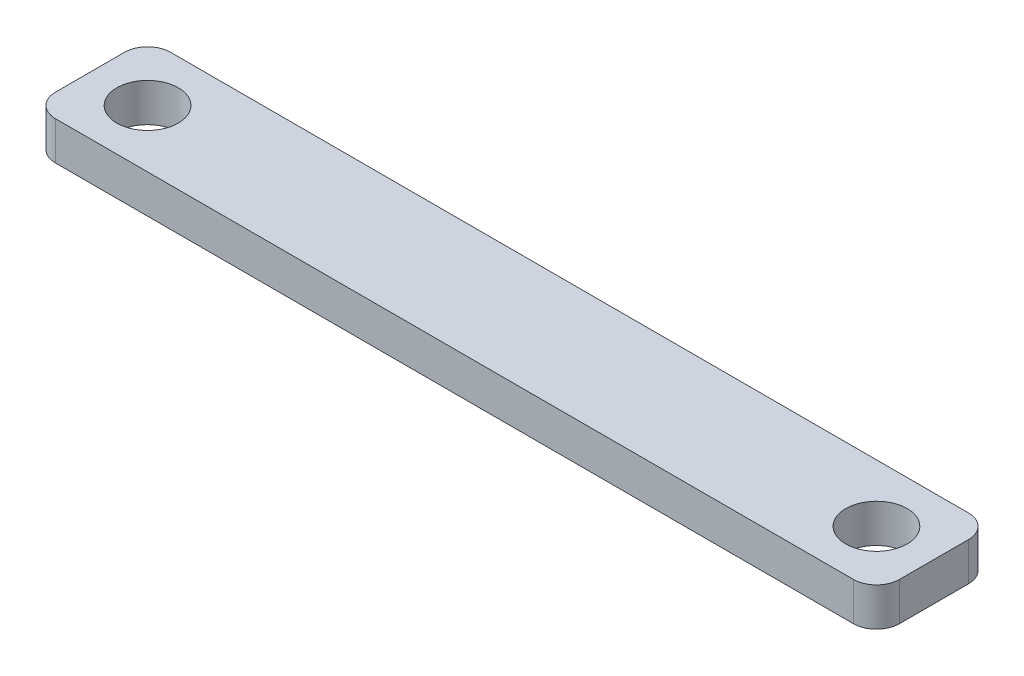
ISO-10303-21;
HEADER;
FILE_DESCRIPTION(('STEP AP214'),'2;1');
FILE_NAME('part.step','',(''),(''),'','','');
FILE_SCHEMA(('AUTOMOTIVE_DESIGN { 1 0 10303 214 1 1 1 1 }'));
ENDSEC;
DATA;
#1=APPLICATION_CONTEXT('core data for automotive mechanical design processes');
#2=APPLICATION_PROTOCOL_DEFINITION('international standard','automotive_design',2000,#1);
#3=PRODUCT_CONTEXT('',#1,'mechanical');
#4=PRODUCT('Part','Part','',(#3));
#5=PRODUCT_RELATED_PRODUCT_CATEGORY('part','',(#4));
#6=PRODUCT_DEFINITION_FORMATION('','',#4);
#7=PRODUCT_DEFINITION_CONTEXT('part definition',#1,'design');
#8=PRODUCT_DEFINITION('design','',#6,#7);
#9=PRODUCT_DEFINITION_SHAPE('','',#8);
#10=(LENGTH_UNIT() NAMED_UNIT(*) SI_UNIT(.MILLI.,.METRE.));
#11=(NAMED_UNIT(*) PLANE_ANGLE_UNIT() SI_UNIT($,.RADIAN.));
#12=(NAMED_UNIT(*) SI_UNIT($,.STERADIAN.) SOLID_ANGLE_UNIT());
#13=UNCERTAINTY_MEASURE_WITH_UNIT(LENGTH_MEASURE(1.E-05),#10,'distance_accuracy_value','');
#14=(GEOMETRIC_REPRESENTATION_CONTEXT(3) GLOBAL_UNCERTAINTY_ASSIGNED_CONTEXT((#13)) GLOBAL_UNIT_ASSIGNED_CONTEXT((#10,
#11,#12)) REPRESENTATION_CONTEXT('',''));
#15=CARTESIAN_POINT('',(0.,0.,0.));
#16=DIRECTION('',(0.,0.,1.));
#17=DIRECTION('',(1.,0.,0.));
#18=AXIS2_PLACEMENT_3D('',#15,#16,#17);
#19=CARTESIAN_POINT('',(55.,5.,7.5));
#20=DIRECTION('',(-1.,0.,0.));
#21=DIRECTION('',(0.,0.,1.));
#22=AXIS2_PLACEMENT_3D('',#19,#20,#21);
#23=PLANE('',#22);
#24=DIRECTION('',(0.,0.,-1.));
#25=VECTOR('',#24,1.);
#26=CARTESIAN_POINT('',(55.,5.,7.5));
#27=LINE('',#26,#25);
#28=CARTESIAN_POINT('',(55.,5.,4.5));
#29=VERTEX_POINT('',#28);
#30=CARTESIAN_POINT('',(55.,5.,-4.5));
#31=VERTEX_POINT('',#30);
#32=EDGE_CURVE('E118',#29,#31,#27,.T.);
#33=ORIENTED_EDGE('',*,*,#32,.F.);
#34=DIRECTION('',(0.,-1.,0.));
#35=VECTOR('',#34,1.);
#36=CARTESIAN_POINT('',(55.,5.,4.5));
#37=LINE('',#36,#35);
#38=CARTESIAN_POINT('',(55.,0.,4.5));
#39=VERTEX_POINT('',#38);
#40=EDGE_CURVE('E103',#29,#39,#37,.T.);
#41=ORIENTED_EDGE('',*,*,#40,.T.);
#42=DIRECTION('',(0.,0.,-1.));
#43=VECTOR('',#42,1.);
#44=CARTESIAN_POINT('',(55.,0.,7.5));
#45=LINE('',#44,#43);
#46=CARTESIAN_POINT('',(55.,0.,-4.5));
#47=VERTEX_POINT('',#46);
#48=EDGE_CURVE('E115',#39,#47,#45,.T.);
#49=ORIENTED_EDGE('',*,*,#48,.T.);
#50=DIRECTION('',(0.,-1.,0.));
#51=VECTOR('',#50,1.);
#52=CARTESIAN_POINT('',(55.,5.,-4.5));
#53=LINE('',#52,#51);
#54=EDGE_CURVE('E120',#47,#31,#53,.F.);
#55=ORIENTED_EDGE('',*,*,#54,.T.);
#56=EDGE_LOOP('',(#33,#41,#49,#55));
#57=FACE_BOUND('',#56,.T.);
#58=ADVANCED_FACE('F34',(#57),#23,.F.);
#59=CARTESIAN_POINT('',(-55.,5.,-7.5));
#60=DIRECTION('',(0.,0.,1.));
#61=DIRECTION('',(1.,0.,0.));
#62=AXIS2_PLACEMENT_3D('',#59,#60,#61);
#63=PLANE('',#62);
#64=DIRECTION('',(-1.,0.,0.));
#65=VECTOR('',#64,1.);
#66=CARTESIAN_POINT('',(-55.,5.,-7.5));
#67=LINE('',#66,#65);
#68=CARTESIAN_POINT('',(52.,5.,-7.5));
#69=VERTEX_POINT('',#68);
#70=CARTESIAN_POINT('',(-52.,5.,-7.5));
#71=VERTEX_POINT('',#70);
#72=EDGE_CURVE('E173',#69,#71,#67,.T.);
#73=ORIENTED_EDGE('',*,*,#72,.F.);
#74=DIRECTION('',(0.,-1.,0.));
#75=VECTOR('',#74,1.);
#76=CARTESIAN_POINT('',(52.,5.,-7.5));
#77=LINE('',#76,#75);
#78=CARTESIAN_POINT('',(52.,0.,-7.5));
#79=VERTEX_POINT('',#78);
#80=EDGE_CURVE('E157',#69,#79,#77,.T.);
#81=ORIENTED_EDGE('',*,*,#80,.T.);
#82=DIRECTION('',(-1.,0.,0.));
#83=VECTOR('',#82,1.);
#84=CARTESIAN_POINT('',(-55.,0.,-7.5));
#85=LINE('',#84,#83);
#86=CARTESIAN_POINT('',(-52.,0.,-7.5));
#87=VERTEX_POINT('',#86);
#88=EDGE_CURVE('E124',#79,#87,#85,.T.);
#89=ORIENTED_EDGE('',*,*,#88,.T.);
#90=DIRECTION('',(0.,-1.,0.));
#91=VECTOR('',#90,1.);
#92=CARTESIAN_POINT('',(-52.,5.,-7.5));
#93=LINE('',#92,#91);
#94=EDGE_CURVE('E155',#87,#71,#93,.F.);
#95=ORIENTED_EDGE('',*,*,#94,.T.);
#96=EDGE_LOOP('',(#73,#81,#89,#95));
#97=FACE_BOUND('',#96,.T.);
#98=ADVANCED_FACE('F206',(#97),#63,.F.);
#99=CARTESIAN_POINT('',(-55.,5.,7.5));
#100=DIRECTION('',(1.,0.,0.));
#101=DIRECTION('',(0.,0.,-1.));
#102=AXIS2_PLACEMENT_3D('',#99,#100,#101);
#103=PLANE('',#102);
#104=DIRECTION('',(0.,0.,1.));
#105=VECTOR('',#104,1.);
#106=CARTESIAN_POINT('',(-55.,0.,7.5));
#107=LINE('',#106,#105);
#108=CARTESIAN_POINT('',(-55.,0.,-4.5));
#109=VERTEX_POINT('',#108);
#110=CARTESIAN_POINT('',(-55.,0.,4.5));
#111=VERTEX_POINT('',#110);
#112=EDGE_CURVE('E128',#109,#111,#107,.T.);
#113=ORIENTED_EDGE('',*,*,#112,.T.);
#114=DIRECTION('',(0.,-1.,0.));
#115=VECTOR('',#114,1.);
#116=CARTESIAN_POINT('',(-55.,5.,4.5));
#117=LINE('',#116,#115);
#118=CARTESIAN_POINT('',(-55.,5.,4.5));
#119=VERTEX_POINT('',#118);
#120=EDGE_CURVE('E11',#111,#119,#117,.F.);
#121=ORIENTED_EDGE('',*,*,#120,.T.);
#122=DIRECTION('',(0.,0.,1.));
#123=VECTOR('',#122,1.);
#124=CARTESIAN_POINT('',(-55.,5.,7.5));
#125=LINE('',#124,#123);
#126=CARTESIAN_POINT('',(-55.,5.,-4.5));
#127=VERTEX_POINT('',#126);
#128=EDGE_CURVE('E163',#127,#119,#125,.T.);
#129=ORIENTED_EDGE('',*,*,#128,.F.);
#130=DIRECTION('',(0.,-1.,0.));
#131=VECTOR('',#130,1.);
#132=CARTESIAN_POINT('',(-55.,5.,-4.5));
#133=LINE('',#132,#131);
#134=EDGE_CURVE('E42',#127,#109,#133,.T.);
#135=ORIENTED_EDGE('',*,*,#134,.T.);
#136=EDGE_LOOP('',(#113,#121,#129,#135));
#137=FACE_BOUND('',#136,.T.);
#138=ADVANCED_FACE('F162',(#137),#103,.F.);
#139=CARTESIAN_POINT('',(-55.,5.,7.5));
#140=DIRECTION('',(0.,0.,-1.));
#141=DIRECTION('',(-1.,0.,0.));
#142=AXIS2_PLACEMENT_3D('',#139,#140,#141);
#143=PLANE('',#142);
#144=DIRECTION('',(1.,0.,0.));
#145=VECTOR('',#144,1.);
#146=CARTESIAN_POINT('',(-55.,0.,7.5));
#147=LINE('',#146,#145);
#148=CARTESIAN_POINT('',(-52.,0.,7.5));
#149=VERTEX_POINT('',#148);
#150=CARTESIAN_POINT('',(52.,0.,7.5));
#151=VERTEX_POINT('',#150);
#152=EDGE_CURVE('E138',#149,#151,#147,.T.);
#153=ORIENTED_EDGE('',*,*,#152,.T.);
#154=DIRECTION('',(0.,-1.,0.));
#155=VECTOR('',#154,1.);
#156=CARTESIAN_POINT('',(52.,5.,7.5));
#157=LINE('',#156,#155);
#158=CARTESIAN_POINT('',(52.,5.,7.5));
#159=VERTEX_POINT('',#158);
#160=EDGE_CURVE('E104',#151,#159,#157,.F.);
#161=ORIENTED_EDGE('',*,*,#160,.T.);
#162=DIRECTION('',(1.,0.,0.));
#163=VECTOR('',#162,1.);
#164=CARTESIAN_POINT('',(-55.,5.,7.5));
#165=LINE('',#164,#163);
#166=CARTESIAN_POINT('',(-52.,5.,7.5));
#167=VERTEX_POINT('',#166);
#168=EDGE_CURVE('E134',#167,#159,#165,.T.);
#169=ORIENTED_EDGE('',*,*,#168,.F.);
#170=DIRECTION('',(0.,-1.,0.));
#171=VECTOR('',#170,1.);
#172=CARTESIAN_POINT('',(-52.,5.,7.5));
#173=LINE('',#172,#171);
#174=EDGE_CURVE('E109',#167,#149,#173,.T.);
#175=ORIENTED_EDGE('',*,*,#174,.T.);
#176=EDGE_LOOP('',(#153,#161,#169,#175));
#177=FACE_BOUND('',#176,.T.);
#178=ADVANCED_FACE('F171',(#177),#143,.F.);
#179=CARTESIAN_POINT('',(0.,5.,0.));
#180=DIRECTION('',(0.,-1.,0.));
#181=DIRECTION('',(0.,0.,-1.));
#182=AXIS2_PLACEMENT_3D('',#179,#180,#181);
#183=PLANE('',#182);
#184=CARTESIAN_POINT('',(-47.5,5.,0.));
#185=DIRECTION('',(0.,1.,0.));
#186=DIRECTION('',(0.,0.,1.));
#187=AXIS2_PLACEMENT_3D('',#184,#185,#186);
#188=CIRCLE('',#187,4.00000000000001);
#189=CARTESIAN_POINT('',(-47.5,5.,4.00000000000001));
#190=VERTEX_POINT('',#189);
#191=EDGE_CURVE('E131',#190,#190,#188,.T.);
#192=ORIENTED_EDGE('',*,*,#191,.F.);
#193=EDGE_LOOP('',(#192));
#194=FACE_BOUND('',#193,.T.);
#195=CARTESIAN_POINT('',(47.5,5.,0.));
#196=DIRECTION('',(0.,1.,0.));
#197=DIRECTION('',(0.,0.,1.));
#198=AXIS2_PLACEMENT_3D('',#195,#196,#197);
#199=CIRCLE('',#198,4.00000000000001);
#200=CARTESIAN_POINT('',(47.5,5.,4.00000000000001));
#201=VERTEX_POINT('',#200);
#202=EDGE_CURVE('E177',#201,#201,#199,.T.);
#203=ORIENTED_EDGE('',*,*,#202,.F.);
#204=EDGE_LOOP('',(#203));
#205=FACE_BOUND('',#204,.T.);
#206=ORIENTED_EDGE('',*,*,#168,.T.);
#207=CARTESIAN_POINT('',(52.,5.,4.5));
#208=DIRECTION('',(0.,-1.,0.));
#209=DIRECTION('',(0.,0.,-1.));
#210=AXIS2_PLACEMENT_3D('',#207,#208,#209);
#211=CIRCLE('',#210,3.);
#212=EDGE_CURVE('E153',#159,#29,#211,.F.);
#213=ORIENTED_EDGE('',*,*,#212,.T.);
#214=ORIENTED_EDGE('',*,*,#32,.T.);
#215=CARTESIAN_POINT('',(52.,5.,-4.5));
#216=DIRECTION('',(0.,-1.,0.));
#217=DIRECTION('',(0.,0.,-1.));
#218=AXIS2_PLACEMENT_3D('',#215,#216,#217);
#219=CIRCLE('',#218,3.);
#220=EDGE_CURVE('E151',#31,#69,#219,.F.);
#221=ORIENTED_EDGE('',*,*,#220,.T.);
#222=ORIENTED_EDGE('',*,*,#72,.T.);
#223=CARTESIAN_POINT('',(-52.,5.,-4.5));
#224=DIRECTION('',(0.,-1.,0.));
#225=DIRECTION('',(0.,0.,-1.));
#226=AXIS2_PLACEMENT_3D('',#223,#224,#225);
#227=CIRCLE('',#226,3.);
#228=EDGE_CURVE('E54',#71,#127,#227,.F.);
#229=ORIENTED_EDGE('',*,*,#228,.T.);
#230=ORIENTED_EDGE('',*,*,#128,.T.);
#231=CARTESIAN_POINT('',(-52.,5.,4.5));
#232=DIRECTION('',(0.,-1.,0.));
#233=DIRECTION('',(0.,0.,-1.));
#234=AXIS2_PLACEMENT_3D('',#231,#232,#233);
#235=CIRCLE('',#234,3.);
#236=EDGE_CURVE('E149',#119,#167,#235,.F.);
#237=ORIENTED_EDGE('',*,*,#236,.T.);
#238=EDGE_LOOP('',(#206,#213,#214,#221,#222,#229,#230,#237));
#239=FACE_BOUND('',#238,.T.);
#240=ADVANCED_FACE('F188',(#194,#205,#239),#183,.F.);
#241=CARTESIAN_POINT('',(0.,0.,0.));
#242=DIRECTION('',(0.,-1.,0.));
#243=DIRECTION('',(0.,0.,-1.));
#244=AXIS2_PLACEMENT_3D('',#241,#242,#243);
#245=PLANE('',#244);
#246=CARTESIAN_POINT('',(-47.5,0.,0.));
#247=DIRECTION('',(0.,1.,0.));
#248=DIRECTION('',(0.,0.,1.));
#249=AXIS2_PLACEMENT_3D('',#246,#247,#248);
#250=CIRCLE('',#249,4.00000000000001);
#251=CARTESIAN_POINT('',(-47.5,0.,4.00000000000001));
#252=VERTEX_POINT('',#251);
#253=EDGE_CURVE('E125',#252,#252,#250,.T.);
#254=ORIENTED_EDGE('',*,*,#253,.T.);
#255=EDGE_LOOP('',(#254));
#256=FACE_BOUND('',#255,.T.);
#257=CARTESIAN_POINT('',(47.5,0.,0.));
#258=DIRECTION('',(0.,1.,0.));
#259=DIRECTION('',(0.,0.,1.));
#260=AXIS2_PLACEMENT_3D('',#257,#258,#259);
#261=CIRCLE('',#260,4.00000000000001);
#262=CARTESIAN_POINT('',(47.5,0.,4.00000000000001));
#263=VERTEX_POINT('',#262);
#264=EDGE_CURVE('E180',#263,#263,#261,.T.);
#265=ORIENTED_EDGE('',*,*,#264,.T.);
#266=EDGE_LOOP('',(#265));
#267=FACE_BOUND('',#266,.T.);
#268=ORIENTED_EDGE('',*,*,#48,.F.);
#269=CARTESIAN_POINT('',(52.,0.,4.5));
#270=DIRECTION('',(0.,-1.,0.));
#271=DIRECTION('',(0.,0.,-1.));
#272=AXIS2_PLACEMENT_3D('',#269,#270,#271);
#273=CIRCLE('',#272,3.);
#274=EDGE_CURVE('E99',#39,#151,#273,.T.);
#275=ORIENTED_EDGE('',*,*,#274,.T.);
#276=ORIENTED_EDGE('',*,*,#152,.F.);
#277=CARTESIAN_POINT('',(-52.,0.,4.5));
#278=DIRECTION('',(0.,-1.,0.));
#279=DIRECTION('',(0.,0.,-1.));
#280=AXIS2_PLACEMENT_3D('',#277,#278,#279);
#281=CIRCLE('',#280,3.);
#282=EDGE_CURVE('E142',#149,#111,#281,.T.);
#283=ORIENTED_EDGE('',*,*,#282,.T.);
#284=ORIENTED_EDGE('',*,*,#112,.F.);
#285=CARTESIAN_POINT('',(-52.,0.,-4.5));
#286=DIRECTION('',(0.,-1.,0.));
#287=DIRECTION('',(0.,0.,-1.));
#288=AXIS2_PLACEMENT_3D('',#285,#286,#287);
#289=CIRCLE('',#288,3.);
#290=EDGE_CURVE('E119',#109,#87,#289,.T.);
#291=ORIENTED_EDGE('',*,*,#290,.T.);
#292=ORIENTED_EDGE('',*,*,#88,.F.);
#293=CARTESIAN_POINT('',(52.,0.,-4.5));
#294=DIRECTION('',(0.,-1.,0.));
#295=DIRECTION('',(0.,0.,-1.));
#296=AXIS2_PLACEMENT_3D('',#293,#294,#295);
#297=CIRCLE('',#296,3.);
#298=EDGE_CURVE('E110',#79,#47,#297,.T.);
#299=ORIENTED_EDGE('',*,*,#298,.T.);
#300=EDGE_LOOP('',(#268,#275,#276,#283,#284,#291,#292,#299));
#301=FACE_BOUND('',#300,.T.);
#302=ADVANCED_FACE('F122',(#256,#267,#301),#245,.T.);
#303=CARTESIAN_POINT('',(52.,5.,4.5));
#304=DIRECTION('',(0.,-1.,0.));
#305=DIRECTION('',(0.,0.,-1.));
#306=AXIS2_PLACEMENT_3D('',#303,#304,#305);
#307=CYLINDRICAL_SURFACE('',#306,3.);
#308=ORIENTED_EDGE('',*,*,#212,.F.);
#309=ORIENTED_EDGE('',*,*,#160,.F.);
#310=ORIENTED_EDGE('',*,*,#274,.F.);
#311=ORIENTED_EDGE('',*,*,#40,.F.);
#312=EDGE_LOOP('',(#308,#309,#310,#311));
#313=FACE_BOUND('',#312,.T.);
#314=ADVANCED_FACE('F102',(#313),#307,.T.);
#315=CARTESIAN_POINT('',(52.,5.,-4.5));
#316=DIRECTION('',(0.,-1.,0.));
#317=DIRECTION('',(0.,0.,-1.));
#318=AXIS2_PLACEMENT_3D('',#315,#316,#317);
#319=CYLINDRICAL_SURFACE('',#318,3.);
#320=ORIENTED_EDGE('',*,*,#220,.F.);
#321=ORIENTED_EDGE('',*,*,#54,.F.);
#322=ORIENTED_EDGE('',*,*,#298,.F.);
#323=ORIENTED_EDGE('',*,*,#80,.F.);
#324=EDGE_LOOP('',(#320,#321,#322,#323));
#325=FACE_BOUND('',#324,.T.);
#326=ADVANCED_FACE('F217',(#325),#319,.T.);
#327=CARTESIAN_POINT('',(-52.,5.,4.5));
#328=DIRECTION('',(0.,-1.,0.));
#329=DIRECTION('',(0.,0.,-1.));
#330=AXIS2_PLACEMENT_3D('',#327,#328,#329);
#331=CYLINDRICAL_SURFACE('',#330,3.);
#332=ORIENTED_EDGE('',*,*,#236,.F.);
#333=ORIENTED_EDGE('',*,*,#120,.F.);
#334=ORIENTED_EDGE('',*,*,#282,.F.);
#335=ORIENTED_EDGE('',*,*,#174,.F.);
#336=EDGE_LOOP('',(#332,#333,#334,#335));
#337=FACE_BOUND('',#336,.T.);
#338=ADVANCED_FACE('F168',(#337),#331,.T.);
#339=CARTESIAN_POINT('',(-52.,5.,-4.5));
#340=DIRECTION('',(0.,-1.,0.));
#341=DIRECTION('',(0.,0.,-1.));
#342=AXIS2_PLACEMENT_3D('',#339,#340,#341);
#343=CYLINDRICAL_SURFACE('',#342,3.);
#344=ORIENTED_EDGE('',*,*,#228,.F.);
#345=ORIENTED_EDGE('',*,*,#94,.F.);
#346=ORIENTED_EDGE('',*,*,#290,.F.);
#347=ORIENTED_EDGE('',*,*,#134,.F.);
#348=EDGE_LOOP('',(#344,#345,#346,#347));
#349=FACE_BOUND('',#348,.T.);
#350=ADVANCED_FACE('F36',(#349),#343,.T.);
#351=CARTESIAN_POINT('',(47.5,0.,0.));
#352=DIRECTION('',(0.,1.,0.));
#353=DIRECTION('',(0.,0.,1.));
#354=AXIS2_PLACEMENT_3D('',#351,#352,#353);
#355=CYLINDRICAL_SURFACE('',#354,4.00000000000001);
#356=ORIENTED_EDGE('',*,*,#264,.F.);
#357=EDGE_LOOP('',(#356));
#358=FACE_BOUND('',#357,.T.);
#359=ORIENTED_EDGE('',*,*,#202,.T.);
#360=EDGE_LOOP('',(#359));
#361=FACE_BOUND('',#360,.T.);
#362=ADVANCED_FACE('F194',(#358,#361),#355,.F.);
#363=CARTESIAN_POINT('',(-47.5,0.,0.));
#364=DIRECTION('',(0.,1.,0.));
#365=DIRECTION('',(0.,0.,1.));
#366=AXIS2_PLACEMENT_3D('',#363,#364,#365);
#367=CYLINDRICAL_SURFACE('',#366,4.00000000000001);
#368=ORIENTED_EDGE('',*,*,#253,.F.);
#369=EDGE_LOOP('',(#368));
#370=FACE_BOUND('',#369,.T.);
#371=ORIENTED_EDGE('',*,*,#191,.T.);
#372=EDGE_LOOP('',(#371));
#373=FACE_BOUND('',#372,.T.);
#374=ADVANCED_FACE('F186',(#370,#373),#367,.F.);
#375=CLOSED_SHELL('',(#58,#98,#138,#178,#240,#302,#314,#326,#338,#350,#362,#374));
#376=MANIFOLD_SOLID_BREP('B2',#375);
#377=ADVANCED_BREP_SHAPE_REPRESENTATION('',(#18,#376),#14);
#378=SHAPE_DEFINITION_REPRESENTATION(#9,#377);
ENDSEC;
END-ISO-10303-21;
